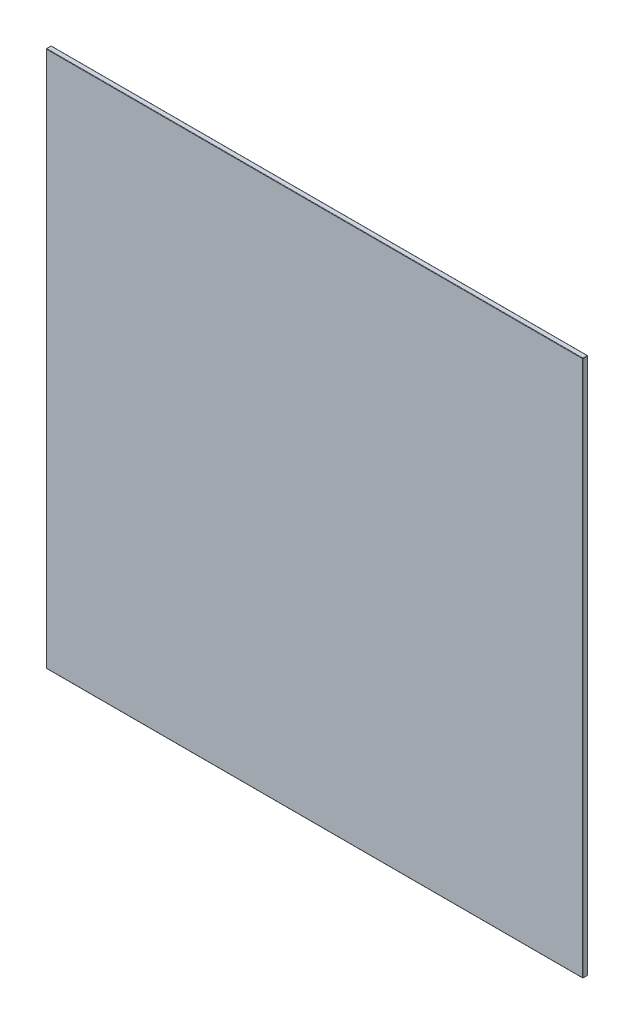
ISO-10303-21;
HEADER;
FILE_DESCRIPTION(('STEP AP214'),'2;1');
FILE_NAME('part.step','',(''),(''),'','','');
FILE_SCHEMA(('AUTOMOTIVE_DESIGN { 1 0 10303 214 1 1 1 1 }'));
ENDSEC;
DATA;
#1=APPLICATION_CONTEXT('core data for automotive mechanical design processes');
#2=APPLICATION_PROTOCOL_DEFINITION('international standard','automotive_design',2000,#1);
#3=PRODUCT_CONTEXT('',#1,'mechanical');
#4=PRODUCT('Part','Part','',(#3));
#5=PRODUCT_RELATED_PRODUCT_CATEGORY('part','',(#4));
#6=PRODUCT_DEFINITION_FORMATION('','',#4);
#7=PRODUCT_DEFINITION_CONTEXT('part definition',#1,'design');
#8=PRODUCT_DEFINITION('design','',#6,#7);
#9=PRODUCT_DEFINITION_SHAPE('','',#8);
#10=(LENGTH_UNIT() NAMED_UNIT(*) SI_UNIT(.MILLI.,.METRE.));
#11=(NAMED_UNIT(*) PLANE_ANGLE_UNIT() SI_UNIT($,.RADIAN.));
#12=(NAMED_UNIT(*) SI_UNIT($,.STERADIAN.) SOLID_ANGLE_UNIT());
#13=UNCERTAINTY_MEASURE_WITH_UNIT(LENGTH_MEASURE(1.E-05),#10,'distance_accuracy_value','');
#14=(GEOMETRIC_REPRESENTATION_CONTEXT(3) GLOBAL_UNCERTAINTY_ASSIGNED_CONTEXT((#13)) GLOBAL_UNIT_ASSIGNED_CONTEXT((#10,
#11,#12)) REPRESENTATION_CONTEXT('',''));
#15=CARTESIAN_POINT('',(0.,0.,0.));
#16=DIRECTION('',(0.,0.,1.));
#17=DIRECTION('',(1.,0.,0.));
#18=AXIS2_PLACEMENT_3D('',#15,#16,#17);
#19=CARTESIAN_POINT('',(160.,-160.,3.));
#20=DIRECTION('',(-1.,0.,0.));
#21=DIRECTION('',(0.,0.,1.));
#22=AXIS2_PLACEMENT_3D('',#19,#20,#21);
#23=PLANE('',#22);
#24=DIRECTION('',(0.,0.,-1.));
#25=VECTOR('',#24,1.);
#26=CARTESIAN_POINT('',(160.,159.75,3.));
#27=LINE('',#26,#25);
#28=CARTESIAN_POINT('',(160.,159.75,0.25));
#29=VERTEX_POINT('',#28);
#30=CARTESIAN_POINT('',(160.,159.75,2.75));
#31=VERTEX_POINT('',#30);
#32=EDGE_CURVE('E215',#29,#31,#27,.F.);
#33=ORIENTED_EDGE('',*,*,#32,.T.);
#34=DIRECTION('',(0.,1.,0.));
#35=VECTOR('',#34,1.);
#36=CARTESIAN_POINT('',(160.,-160.,2.75));
#37=LINE('',#36,#35);
#38=CARTESIAN_POINT('',(160.,-159.75,2.75));
#39=VERTEX_POINT('',#38);
#40=EDGE_CURVE('E218',#31,#39,#37,.F.);
#41=ORIENTED_EDGE('',*,*,#40,.T.);
#42=DIRECTION('',(0.,0.,-1.));
#43=VECTOR('',#42,1.);
#44=CARTESIAN_POINT('',(160.,-159.75,3.));
#45=LINE('',#44,#43);
#46=CARTESIAN_POINT('',(160.,-159.75,0.25));
#47=VERTEX_POINT('',#46);
#48=EDGE_CURVE('E216',#39,#47,#45,.T.);
#49=ORIENTED_EDGE('',*,*,#48,.T.);
#50=DIRECTION('',(0.,1.,0.));
#51=VECTOR('',#50,1.);
#52=CARTESIAN_POINT('',(160.,160.,0.25));
#53=LINE('',#52,#51);
#54=EDGE_CURVE('E212',#47,#29,#53,.T.);
#55=ORIENTED_EDGE('',*,*,#54,.T.);
#56=EDGE_LOOP('',(#33,#41,#49,#55));
#57=FACE_BOUND('',#56,.T.);
#58=ADVANCED_FACE('F33',(#57),#23,.F.);
#59=CARTESIAN_POINT('',(-160.,160.,3.));
#60=DIRECTION('',(0.,-1.,0.));
#61=DIRECTION('',(0.,0.,-1.));
#62=AXIS2_PLACEMENT_3D('',#59,#60,#61);
#63=PLANE('',#62);
#64=DIRECTION('',(-1.,0.,0.));
#65=VECTOR('',#64,1.);
#66=CARTESIAN_POINT('',(-160.,160.,2.75));
#67=LINE('',#66,#65);
#68=CARTESIAN_POINT('',(-159.75,160.,2.75));
#69=VERTEX_POINT('',#68);
#70=CARTESIAN_POINT('',(159.75,160.,2.75));
#71=VERTEX_POINT('',#70);
#72=EDGE_CURVE('E265',#69,#71,#67,.F.);
#73=ORIENTED_EDGE('',*,*,#72,.T.);
#74=DIRECTION('',(0.,0.,-1.));
#75=VECTOR('',#74,1.);
#76=CARTESIAN_POINT('',(159.75,160.,3.));
#77=LINE('',#76,#75);
#78=CARTESIAN_POINT('',(159.75,160.,0.25));
#79=VERTEX_POINT('',#78);
#80=EDGE_CURVE('E259',#71,#79,#77,.T.);
#81=ORIENTED_EDGE('',*,*,#80,.T.);
#82=DIRECTION('',(-1.,0.,0.));
#83=VECTOR('',#82,1.);
#84=CARTESIAN_POINT('',(-160.,160.,0.25));
#85=LINE('',#84,#83);
#86=CARTESIAN_POINT('',(-159.75,160.,0.25));
#87=VERTEX_POINT('',#86);
#88=EDGE_CURVE('E274',#79,#87,#85,.T.);
#89=ORIENTED_EDGE('',*,*,#88,.T.);
#90=DIRECTION('',(0.,0.,-1.));
#91=VECTOR('',#90,1.);
#92=CARTESIAN_POINT('',(-159.75,160.,3.));
#93=LINE('',#92,#91);
#94=EDGE_CURVE('E270',#87,#69,#93,.F.);
#95=ORIENTED_EDGE('',*,*,#94,.T.);
#96=EDGE_LOOP('',(#73,#81,#89,#95));
#97=FACE_BOUND('',#96,.T.);
#98=ADVANCED_FACE('F268',(#97),#63,.F.);
#99=CARTESIAN_POINT('',(-160.,-160.,3.));
#100=DIRECTION('',(1.,0.,0.));
#101=DIRECTION('',(0.,0.,-1.));
#102=AXIS2_PLACEMENT_3D('',#99,#100,#101);
#103=PLANE('',#102);
#104=DIRECTION('',(0.,-1.,0.));
#105=VECTOR('',#104,1.);
#106=CARTESIAN_POINT('',(-160.,-160.,2.75));
#107=LINE('',#106,#105);
#108=CARTESIAN_POINT('',(-160.,-159.75,2.75));
#109=VERTEX_POINT('',#108);
#110=CARTESIAN_POINT('',(-160.,159.75,2.75));
#111=VERTEX_POINT('',#110);
#112=EDGE_CURVE('E152',#109,#111,#107,.F.);
#113=ORIENTED_EDGE('',*,*,#112,.T.);
#114=DIRECTION('',(0.,0.,-1.));
#115=VECTOR('',#114,1.);
#116=CARTESIAN_POINT('',(-160.,159.75,3.));
#117=LINE('',#116,#115);
#118=CARTESIAN_POINT('',(-160.,159.75,0.25));
#119=VERTEX_POINT('',#118);
#120=EDGE_CURVE('E231',#111,#119,#117,.T.);
#121=ORIENTED_EDGE('',*,*,#120,.T.);
#122=DIRECTION('',(0.,-1.,0.));
#123=VECTOR('',#122,1.);
#124=CARTESIAN_POINT('',(-160.,-160.,0.25));
#125=LINE('',#124,#123);
#126=CARTESIAN_POINT('',(-160.,-159.75,0.25));
#127=VERTEX_POINT('',#126);
#128=EDGE_CURVE('E228',#119,#127,#125,.T.);
#129=ORIENTED_EDGE('',*,*,#128,.T.);
#130=DIRECTION('',(0.,0.,-1.));
#131=VECTOR('',#130,1.);
#132=CARTESIAN_POINT('',(-160.,-159.75,3.));
#133=LINE('',#132,#131);
#134=EDGE_CURVE('E226',#127,#109,#133,.F.);
#135=ORIENTED_EDGE('',*,*,#134,.T.);
#136=EDGE_LOOP('',(#113,#121,#129,#135));
#137=FACE_BOUND('',#136,.T.);
#138=ADVANCED_FACE('F327',(#137),#103,.F.);
#139=CARTESIAN_POINT('',(-160.,-160.,3.));
#140=DIRECTION('',(0.,1.,0.));
#141=DIRECTION('',(0.,0.,1.));
#142=AXIS2_PLACEMENT_3D('',#139,#140,#141);
#143=PLANE('',#142);
#144=DIRECTION('',(1.,0.,0.));
#145=VECTOR('',#144,1.);
#146=CARTESIAN_POINT('',(-160.,-160.,2.75));
#147=LINE('',#146,#145);
#148=CARTESIAN_POINT('',(159.75,-160.,2.75));
#149=VERTEX_POINT('',#148);
#150=CARTESIAN_POINT('',(-159.75,-160.,2.75));
#151=VERTEX_POINT('',#150);
#152=EDGE_CURVE('E42',#149,#151,#147,.F.);
#153=ORIENTED_EDGE('',*,*,#152,.T.);
#154=DIRECTION('',(0.,0.,-1.));
#155=VECTOR('',#154,1.);
#156=CARTESIAN_POINT('',(-159.75,-160.,3.));
#157=LINE('',#156,#155);
#158=CARTESIAN_POINT('',(-159.75,-160.,0.25));
#159=VERTEX_POINT('',#158);
#160=EDGE_CURVE('E11',#151,#159,#157,.T.);
#161=ORIENTED_EDGE('',*,*,#160,.T.);
#162=DIRECTION('',(1.,0.,0.));
#163=VECTOR('',#162,1.);
#164=CARTESIAN_POINT('',(160.,-160.,0.25));
#165=LINE('',#164,#163);
#166=CARTESIAN_POINT('',(159.75,-160.,0.25));
#167=VERTEX_POINT('',#166);
#168=EDGE_CURVE('E234',#159,#167,#165,.T.);
#169=ORIENTED_EDGE('',*,*,#168,.T.);
#170=DIRECTION('',(0.,0.,-1.));
#171=VECTOR('',#170,1.);
#172=CARTESIAN_POINT('',(159.75,-160.,3.));
#173=LINE('',#172,#171);
#174=EDGE_CURVE('E53',#167,#149,#173,.F.);
#175=ORIENTED_EDGE('',*,*,#174,.T.);
#176=EDGE_LOOP('',(#153,#161,#169,#175));
#177=FACE_BOUND('',#176,.T.);
#178=ADVANCED_FACE('F489',(#177),#143,.F.);
#179=CARTESIAN_POINT('',(0.,0.,3.));
#180=DIRECTION('',(0.,0.,-1.));
#181=DIRECTION('',(-1.,0.,0.));
#182=AXIS2_PLACEMENT_3D('',#179,#180,#181);
#183=PLANE('',#182);
#184=DIRECTION('',(0.,1.,0.));
#185=VECTOR('',#184,1.);
#186=CARTESIAN_POINT('',(159.75,0.,3.));
#187=LINE('',#186,#185);
#188=CARTESIAN_POINT('',(159.75,-159.75,3.));
#189=VERTEX_POINT('',#188);
#190=CARTESIAN_POINT('',(159.75,159.75,3.));
#191=VERTEX_POINT('',#190);
#192=EDGE_CURVE('E131',#189,#191,#187,.T.);
#193=ORIENTED_EDGE('',*,*,#192,.T.);
#194=DIRECTION('',(-1.,0.,0.));
#195=VECTOR('',#194,1.);
#196=CARTESIAN_POINT('',(0.,159.75,3.));
#197=LINE('',#196,#195);
#198=CARTESIAN_POINT('',(-159.75,159.75,3.));
#199=VERTEX_POINT('',#198);
#200=EDGE_CURVE('E127',#191,#199,#197,.T.);
#201=ORIENTED_EDGE('',*,*,#200,.T.);
#202=DIRECTION('',(0.,-1.,0.));
#203=VECTOR('',#202,1.);
#204=CARTESIAN_POINT('',(-159.75,0.,3.));
#205=LINE('',#204,#203);
#206=CARTESIAN_POINT('',(-159.75,-159.75,3.));
#207=VERTEX_POINT('',#206);
#208=EDGE_CURVE('E121',#199,#207,#205,.T.);
#209=ORIENTED_EDGE('',*,*,#208,.T.);
#210=DIRECTION('',(1.,0.,0.));
#211=VECTOR('',#210,1.);
#212=CARTESIAN_POINT('',(0.,-159.75,3.));
#213=LINE('',#212,#211);
#214=EDGE_CURVE('E124',#207,#189,#213,.T.);
#215=ORIENTED_EDGE('',*,*,#214,.T.);
#216=EDGE_LOOP('',(#193,#201,#209,#215));
#217=FACE_BOUND('',#216,.T.);
#218=ADVANCED_FACE('F123',(#217),#183,.F.);
#219=CARTESIAN_POINT('',(0.,0.,0.));
#220=DIRECTION('',(0.,0.,-1.));
#221=DIRECTION('',(-1.,0.,0.));
#222=AXIS2_PLACEMENT_3D('',#219,#220,#221);
#223=PLANE('',#222);
#224=DIRECTION('',(0.,-1.,0.));
#225=VECTOR('',#224,1.);
#226=CARTESIAN_POINT('',(-159.75,160.,0.));
#227=LINE('',#226,#225);
#228=CARTESIAN_POINT('',(-159.75,-159.75,0.));
#229=VERTEX_POINT('',#228);
#230=CARTESIAN_POINT('',(-159.75,159.75,0.));
#231=VERTEX_POINT('',#230);
#232=EDGE_CURVE('E280',#229,#231,#227,.F.);
#233=ORIENTED_EDGE('',*,*,#232,.T.);
#234=DIRECTION('',(-1.,0.,0.));
#235=VECTOR('',#234,1.);
#236=CARTESIAN_POINT('',(160.,159.75,0.));
#237=LINE('',#236,#235);
#238=CARTESIAN_POINT('',(159.75,159.75,0.));
#239=VERTEX_POINT('',#238);
#240=EDGE_CURVE('E220',#231,#239,#237,.F.);
#241=ORIENTED_EDGE('',*,*,#240,.T.);
#242=DIRECTION('',(0.,1.,0.));
#243=VECTOR('',#242,1.);
#244=CARTESIAN_POINT('',(159.75,-160.,0.));
#245=LINE('',#244,#243);
#246=CARTESIAN_POINT('',(159.75,-159.75,0.));
#247=VERTEX_POINT('',#246);
#248=EDGE_CURVE('E210',#239,#247,#245,.F.);
#249=ORIENTED_EDGE('',*,*,#248,.T.);
#250=DIRECTION('',(1.,0.,0.));
#251=VECTOR('',#250,1.);
#252=CARTESIAN_POINT('',(-160.,-159.75,0.));
#253=LINE('',#252,#251);
#254=EDGE_CURVE('E264',#247,#229,#253,.F.);
#255=ORIENTED_EDGE('',*,*,#254,.T.);
#256=EDGE_LOOP('',(#233,#241,#249,#255));
#257=FACE_BOUND('',#256,.T.);
#258=ADVANCED_FACE('F284',(#257),#223,.T.);
#259=CARTESIAN_POINT('',(-160.,-159.75,0.25));
#260=DIRECTION('',(-1.,0.,0.));
#261=DIRECTION('',(0.,0.,1.));
#262=AXIS2_PLACEMENT_3D('',#259,#260,#261);
#263=CYLINDRICAL_SURFACE('',#262,0.25);
#264=CARTESIAN_POINT('',(159.75,-159.75,0.25));
#265=DIRECTION('',(1.,0.,0.));
#266=DIRECTION('',(0.,0.,-1.));
#267=AXIS2_PLACEMENT_3D('',#264,#265,#266);
#268=CIRCLE('',#267,0.25);
#269=EDGE_CURVE('E37',#167,#247,#268,.T.);
#270=ORIENTED_EDGE('',*,*,#269,.F.);
#271=ORIENTED_EDGE('',*,*,#168,.F.);
#272=CARTESIAN_POINT('',(-159.75,-159.75,0.25));
#273=DIRECTION('',(-1.,0.,0.));
#274=DIRECTION('',(0.,0.,1.));
#275=AXIS2_PLACEMENT_3D('',#272,#273,#274);
#276=CIRCLE('',#275,0.25);
#277=EDGE_CURVE('E190',#229,#159,#276,.T.);
#278=ORIENTED_EDGE('',*,*,#277,.F.);
#279=ORIENTED_EDGE('',*,*,#254,.F.);
#280=EDGE_LOOP('',(#270,#271,#278,#279));
#281=FACE_BOUND('',#280,.T.);
#282=ADVANCED_FACE('F35',(#281),#263,.T.);
#283=CARTESIAN_POINT('',(159.75,-159.75,0.25));
#284=DIRECTION('',(0.,0.,1.));
#285=DIRECTION('',(1.,0.,0.));
#286=AXIS2_PLACEMENT_3D('',#283,#284,#285);
#287=SPHERICAL_SURFACE('',#286,0.25);
#288=CARTESIAN_POINT('',(159.75,-159.75,0.25));
#289=DIRECTION('',(0.,0.,-1.));
#290=DIRECTION('',(-1.,0.,0.));
#291=AXIS2_PLACEMENT_3D('',#288,#289,#290);
#292=CIRCLE('',#291,0.25);
#293=EDGE_CURVE('E185',#167,#47,#292,.F.);
#294=ORIENTED_EDGE('',*,*,#293,.F.);
#295=ORIENTED_EDGE('',*,*,#269,.T.);
#296=CARTESIAN_POINT('',(159.75,-159.75,0.25));
#297=DIRECTION('',(0.,-1.,0.));
#298=DIRECTION('',(0.,0.,-1.));
#299=AXIS2_PLACEMENT_3D('',#296,#297,#298);
#300=CIRCLE('',#299,0.25);
#301=EDGE_CURVE('E188',#47,#247,#300,.F.);
#302=ORIENTED_EDGE('',*,*,#301,.F.);
#303=EDGE_LOOP('',(#294,#295,#302));
#304=FACE_BOUND('',#303,.T.);
#305=ADVANCED_FACE('F202',(#304),#287,.T.);
#306=CARTESIAN_POINT('',(-159.75,-159.75,0.25));
#307=DIRECTION('',(0.,0.,1.));
#308=DIRECTION('',(1.,0.,0.));
#309=AXIS2_PLACEMENT_3D('',#306,#307,#308);
#310=SPHERICAL_SURFACE('',#309,0.25);
#311=CARTESIAN_POINT('',(-159.75,-159.75,0.25));
#312=DIRECTION('',(0.,-1.,0.));
#313=DIRECTION('',(0.,0.,-1.));
#314=AXIS2_PLACEMENT_3D('',#311,#312,#313);
#315=CIRCLE('',#314,0.25);
#316=EDGE_CURVE('E180',#229,#127,#315,.F.);
#317=ORIENTED_EDGE('',*,*,#316,.F.);
#318=ORIENTED_EDGE('',*,*,#277,.T.);
#319=CARTESIAN_POINT('',(-159.75,-159.75,0.25));
#320=DIRECTION('',(0.,0.,-1.));
#321=DIRECTION('',(-1.,0.,0.));
#322=AXIS2_PLACEMENT_3D('',#319,#320,#321);
#323=CIRCLE('',#322,0.25);
#324=EDGE_CURVE('E183',#127,#159,#323,.F.);
#325=ORIENTED_EDGE('',*,*,#324,.F.);
#326=EDGE_LOOP('',(#317,#318,#325));
#327=FACE_BOUND('',#326,.T.);
#328=ADVANCED_FACE('F455',(#327),#310,.T.);
#329=CARTESIAN_POINT('',(159.75,-160.,0.25));
#330=DIRECTION('',(0.,-1.,0.));
#331=DIRECTION('',(0.,0.,-1.));
#332=AXIS2_PLACEMENT_3D('',#329,#330,#331);
#333=CYLINDRICAL_SURFACE('',#332,0.25);
#334=ORIENTED_EDGE('',*,*,#301,.T.);
#335=ORIENTED_EDGE('',*,*,#248,.F.);
#336=CARTESIAN_POINT('',(159.75,159.75,0.25));
#337=DIRECTION('',(0.,1.,0.));
#338=DIRECTION('',(0.,0.,1.));
#339=AXIS2_PLACEMENT_3D('',#336,#337,#338);
#340=CIRCLE('',#339,0.25);
#341=EDGE_CURVE('E175',#29,#239,#340,.T.);
#342=ORIENTED_EDGE('',*,*,#341,.F.);
#343=ORIENTED_EDGE('',*,*,#54,.F.);
#344=EDGE_LOOP('',(#334,#335,#342,#343));
#345=FACE_BOUND('',#344,.T.);
#346=ADVANCED_FACE('F208',(#345),#333,.T.);
#347=CARTESIAN_POINT('',(159.75,-159.75,3.));
#348=DIRECTION('',(0.,0.,-1.));
#349=DIRECTION('',(-1.,0.,0.));
#350=AXIS2_PLACEMENT_3D('',#347,#348,#349);
#351=CYLINDRICAL_SURFACE('',#350,0.25);
#352=ORIENTED_EDGE('',*,*,#293,.T.);
#353=ORIENTED_EDGE('',*,*,#48,.F.);
#354=CARTESIAN_POINT('',(159.75,-159.75,2.75));
#355=DIRECTION('',(0.,0.,1.));
#356=DIRECTION('',(1.,0.,0.));
#357=AXIS2_PLACEMENT_3D('',#354,#355,#356);
#358=CIRCLE('',#357,0.25);
#359=EDGE_CURVE('E172',#149,#39,#358,.T.);
#360=ORIENTED_EDGE('',*,*,#359,.F.);
#361=ORIENTED_EDGE('',*,*,#174,.F.);
#362=EDGE_LOOP('',(#352,#353,#360,#361));
#363=FACE_BOUND('',#362,.T.);
#364=ADVANCED_FACE('F309',(#363),#351,.T.);
#365=CARTESIAN_POINT('',(0.,-159.75,2.75));
#366=DIRECTION('',(1.,0.,0.));
#367=DIRECTION('',(0.,0.,-1.));
#368=AXIS2_PLACEMENT_3D('',#365,#366,#367);
#369=CYLINDRICAL_SURFACE('',#368,0.25);
#370=CARTESIAN_POINT('',(-159.75,-159.75,2.75));
#371=DIRECTION('',(-1.,0.,0.));
#372=DIRECTION('',(0.,0.,1.));
#373=AXIS2_PLACEMENT_3D('',#370,#371,#372);
#374=CIRCLE('',#373,0.25);
#375=EDGE_CURVE('E137',#151,#207,#374,.T.);
#376=ORIENTED_EDGE('',*,*,#375,.F.);
#377=ORIENTED_EDGE('',*,*,#152,.F.);
#378=CARTESIAN_POINT('',(159.75,-159.75,2.75));
#379=DIRECTION('',(1.,0.,0.));
#380=DIRECTION('',(0.,0.,-1.));
#381=AXIS2_PLACEMENT_3D('',#378,#379,#380);
#382=CIRCLE('',#381,0.25);
#383=EDGE_CURVE('E140',#189,#149,#382,.T.);
#384=ORIENTED_EDGE('',*,*,#383,.F.);
#385=ORIENTED_EDGE('',*,*,#214,.F.);
#386=EDGE_LOOP('',(#376,#377,#384,#385));
#387=FACE_BOUND('',#386,.T.);
#388=ADVANCED_FACE('F136',(#387),#369,.T.);
#389=CARTESIAN_POINT('',(-159.75,-159.75,3.));
#390=DIRECTION('',(0.,0.,-1.));
#391=DIRECTION('',(-1.,0.,0.));
#392=AXIS2_PLACEMENT_3D('',#389,#390,#391);
#393=CYLINDRICAL_SURFACE('',#392,0.25);
#394=ORIENTED_EDGE('',*,*,#324,.T.);
#395=ORIENTED_EDGE('',*,*,#160,.F.);
#396=CARTESIAN_POINT('',(-159.75,-159.75,2.75));
#397=DIRECTION('',(0.,0.,1.));
#398=DIRECTION('',(1.,0.,0.));
#399=AXIS2_PLACEMENT_3D('',#396,#397,#398);
#400=CIRCLE('',#399,0.25);
#401=EDGE_CURVE('E149',#109,#151,#400,.T.);
#402=ORIENTED_EDGE('',*,*,#401,.F.);
#403=ORIENTED_EDGE('',*,*,#134,.F.);
#404=EDGE_LOOP('',(#394,#395,#402,#403));
#405=FACE_BOUND('',#404,.T.);
#406=ADVANCED_FACE('F425',(#405),#393,.T.);
#407=CARTESIAN_POINT('',(-159.75,-160.,0.25));
#408=DIRECTION('',(0.,1.,0.));
#409=DIRECTION('',(0.,0.,1.));
#410=AXIS2_PLACEMENT_3D('',#407,#408,#409);
#411=CYLINDRICAL_SURFACE('',#410,0.25);
#412=ORIENTED_EDGE('',*,*,#316,.T.);
#413=ORIENTED_EDGE('',*,*,#128,.F.);
#414=CARTESIAN_POINT('',(-159.75,159.75,0.25));
#415=DIRECTION('',(1.11022302462516E-13,1.,0.));
#416=DIRECTION('',(-1.,1.11022302462516E-13,0.));
#417=AXIS2_PLACEMENT_3D('',#414,#415,#416);
#418=CIRCLE('',#417,0.25);
#419=EDGE_CURVE('E167',#231,#119,#418,.T.);
#420=ORIENTED_EDGE('',*,*,#419,.F.);
#421=ORIENTED_EDGE('',*,*,#232,.F.);
#422=EDGE_LOOP('',(#412,#413,#420,#421));
#423=FACE_BOUND('',#422,.T.);
#424=ADVANCED_FACE('F294',(#423),#411,.T.);
#425=CARTESIAN_POINT('',(-160.,159.75,0.25));
#426=DIRECTION('',(1.,0.,0.));
#427=DIRECTION('',(0.,0.,-1.));
#428=AXIS2_PLACEMENT_3D('',#425,#426,#427);
#429=CYLINDRICAL_SURFACE('',#428,0.25);
#430=CARTESIAN_POINT('',(159.75,159.75,0.25));
#431=DIRECTION('',(1.,1.11022302462516E-13,0.));
#432=DIRECTION('',(-1.11022302462516E-13,1.,0.));
#433=AXIS2_PLACEMENT_3D('',#430,#431,#432);
#434=CIRCLE('',#433,0.25);
#435=EDGE_CURVE('E177',#239,#79,#434,.T.);
#436=ORIENTED_EDGE('',*,*,#435,.F.);
#437=ORIENTED_EDGE('',*,*,#240,.F.);
#438=CARTESIAN_POINT('',(-159.75,159.75,0.25));
#439=DIRECTION('',(-1.,0.,0.));
#440=DIRECTION('',(0.,0.,1.));
#441=AXIS2_PLACEMENT_3D('',#438,#439,#440);
#442=CIRCLE('',#441,0.25);
#443=EDGE_CURVE('E164',#87,#231,#442,.T.);
#444=ORIENTED_EDGE('',*,*,#443,.F.);
#445=ORIENTED_EDGE('',*,*,#88,.F.);
#446=EDGE_LOOP('',(#436,#437,#444,#445));
#447=FACE_BOUND('',#446,.T.);
#448=ADVANCED_FACE('F290',(#447),#429,.T.);
#449=CARTESIAN_POINT('',(159.75,159.75,0.25));
#450=DIRECTION('',(0.,0.,1.));
#451=DIRECTION('',(1.,0.,0.));
#452=AXIS2_PLACEMENT_3D('',#449,#450,#451);
#453=SPHERICAL_SURFACE('',#452,0.25);
#454=ORIENTED_EDGE('',*,*,#341,.T.);
#455=ORIENTED_EDGE('',*,*,#435,.T.);
#456=CARTESIAN_POINT('',(159.75,159.75,0.25));
#457=DIRECTION('',(0.,0.,-1.));
#458=DIRECTION('',(-1.,0.,0.));
#459=AXIS2_PLACEMENT_3D('',#456,#457,#458);
#460=CIRCLE('',#459,0.25);
#461=EDGE_CURVE('E156',#29,#79,#460,.F.);
#462=ORIENTED_EDGE('',*,*,#461,.F.);
#463=EDGE_LOOP('',(#454,#455,#462));
#464=FACE_BOUND('',#463,.T.);
#465=ADVANCED_FACE('F313',(#464),#453,.T.);
#466=CARTESIAN_POINT('',(159.75,-159.75,2.75));
#467=DIRECTION('',(0.,0.,1.));
#468=DIRECTION('',(1.,0.,0.));
#469=AXIS2_PLACEMENT_3D('',#466,#467,#468);
#470=SPHERICAL_SURFACE('',#469,0.25);
#471=ORIENTED_EDGE('',*,*,#383,.T.);
#472=ORIENTED_EDGE('',*,*,#359,.T.);
#473=CARTESIAN_POINT('',(159.75,-159.75,2.75));
#474=DIRECTION('',(0.,-1.,0.));
#475=DIRECTION('',(0.,0.,-1.));
#476=AXIS2_PLACEMENT_3D('',#473,#474,#475);
#477=CIRCLE('',#476,0.25);
#478=EDGE_CURVE('E153',#189,#39,#477,.F.);
#479=ORIENTED_EDGE('',*,*,#478,.F.);
#480=EDGE_LOOP('',(#471,#472,#479));
#481=FACE_BOUND('',#480,.T.);
#482=ADVANCED_FACE('F311',(#481),#470,.T.);
#483=CARTESIAN_POINT('',(-159.75,-159.75,2.75));
#484=DIRECTION('',(0.,0.,1.));
#485=DIRECTION('',(1.,0.,0.));
#486=AXIS2_PLACEMENT_3D('',#483,#484,#485);
#487=SPHERICAL_SURFACE('',#486,0.25);
#488=ORIENTED_EDGE('',*,*,#401,.T.);
#489=ORIENTED_EDGE('',*,*,#375,.T.);
#490=CARTESIAN_POINT('',(-159.75,-159.75,2.75));
#491=DIRECTION('',(0.,-1.,0.));
#492=DIRECTION('',(0.,0.,-1.));
#493=AXIS2_PLACEMENT_3D('',#490,#491,#492);
#494=CIRCLE('',#493,0.25);
#495=EDGE_CURVE('E146',#109,#207,#494,.F.);
#496=ORIENTED_EDGE('',*,*,#495,.F.);
#497=EDGE_LOOP('',(#488,#489,#496));
#498=FACE_BOUND('',#497,.T.);
#499=ADVANCED_FACE('F145',(#498),#487,.T.);
#500=CARTESIAN_POINT('',(-159.75,159.75,0.25));
#501=DIRECTION('',(0.,0.,1.));
#502=DIRECTION('',(1.,0.,0.));
#503=AXIS2_PLACEMENT_3D('',#500,#501,#502);
#504=SPHERICAL_SURFACE('',#503,0.25);
#505=ORIENTED_EDGE('',*,*,#443,.T.);
#506=ORIENTED_EDGE('',*,*,#419,.T.);
#507=CARTESIAN_POINT('',(-159.75,159.75,0.25));
#508=DIRECTION('',(0.,0.,-1.));
#509=DIRECTION('',(-1.,0.,0.));
#510=AXIS2_PLACEMENT_3D('',#507,#508,#509);
#511=CIRCLE('',#510,0.25);
#512=EDGE_CURVE('E154',#87,#119,#511,.F.);
#513=ORIENTED_EDGE('',*,*,#512,.F.);
#514=EDGE_LOOP('',(#505,#506,#513));
#515=FACE_BOUND('',#514,.T.);
#516=ADVANCED_FACE('F296',(#515),#504,.T.);
#517=CARTESIAN_POINT('',(159.75,159.75,3.));
#518=DIRECTION('',(0.,0.,-1.));
#519=DIRECTION('',(-1.,0.,0.));
#520=AXIS2_PLACEMENT_3D('',#517,#518,#519);
#521=CYLINDRICAL_SURFACE('',#520,0.25);
#522=ORIENTED_EDGE('',*,*,#461,.T.);
#523=ORIENTED_EDGE('',*,*,#80,.F.);
#524=CARTESIAN_POINT('',(159.75,159.75,2.75));
#525=DIRECTION('',(0.,0.,1.));
#526=DIRECTION('',(1.,0.,0.));
#527=AXIS2_PLACEMENT_3D('',#524,#525,#526);
#528=CIRCLE('',#527,0.25);
#529=EDGE_CURVE('E158',#31,#71,#528,.T.);
#530=ORIENTED_EDGE('',*,*,#529,.F.);
#531=ORIENTED_EDGE('',*,*,#32,.F.);
#532=EDGE_LOOP('',(#522,#523,#530,#531));
#533=FACE_BOUND('',#532,.T.);
#534=ADVANCED_FACE('F261',(#533),#521,.T.);
#535=CARTESIAN_POINT('',(159.75,0.,2.75));
#536=DIRECTION('',(0.,1.,0.));
#537=DIRECTION('',(0.,0.,1.));
#538=AXIS2_PLACEMENT_3D('',#535,#536,#537);
#539=CYLINDRICAL_SURFACE('',#538,0.25);
#540=ORIENTED_EDGE('',*,*,#478,.T.);
#541=ORIENTED_EDGE('',*,*,#40,.F.);
#542=CARTESIAN_POINT('',(159.75,159.75,2.75));
#543=DIRECTION('',(0.,1.,0.));
#544=DIRECTION('',(0.,0.,1.));
#545=AXIS2_PLACEMENT_3D('',#542,#543,#544);
#546=CIRCLE('',#545,0.25);
#547=EDGE_CURVE('E248',#191,#31,#546,.T.);
#548=ORIENTED_EDGE('',*,*,#547,.F.);
#549=ORIENTED_EDGE('',*,*,#192,.F.);
#550=EDGE_LOOP('',(#540,#541,#548,#549));
#551=FACE_BOUND('',#550,.T.);
#552=ADVANCED_FACE('F305',(#551),#539,.T.);
#553=CARTESIAN_POINT('',(-159.75,0.,2.75));
#554=DIRECTION('',(0.,-1.,0.));
#555=DIRECTION('',(0.,0.,-1.));
#556=AXIS2_PLACEMENT_3D('',#553,#554,#555);
#557=CYLINDRICAL_SURFACE('',#556,0.25);
#558=ORIENTED_EDGE('',*,*,#495,.T.);
#559=ORIENTED_EDGE('',*,*,#208,.F.);
#560=CARTESIAN_POINT('',(-159.75,159.75,2.75));
#561=DIRECTION('',(0.,1.,1.11022302462516E-13));
#562=DIRECTION('',(0.,-1.11022302462516E-13,1.));
#563=AXIS2_PLACEMENT_3D('',#560,#561,#562);
#564=CIRCLE('',#563,0.25);
#565=EDGE_CURVE('E245',#111,#199,#564,.T.);
#566=ORIENTED_EDGE('',*,*,#565,.F.);
#567=ORIENTED_EDGE('',*,*,#112,.F.);
#568=EDGE_LOOP('',(#558,#559,#566,#567));
#569=FACE_BOUND('',#568,.T.);
#570=ADVANCED_FACE('F151',(#569),#557,.T.);
#571=CARTESIAN_POINT('',(-159.75,159.75,3.));
#572=DIRECTION('',(0.,0.,-1.));
#573=DIRECTION('',(-1.,0.,0.));
#574=AXIS2_PLACEMENT_3D('',#571,#572,#573);
#575=CYLINDRICAL_SURFACE('',#574,0.25);
#576=ORIENTED_EDGE('',*,*,#512,.T.);
#577=ORIENTED_EDGE('',*,*,#120,.F.);
#578=CARTESIAN_POINT('',(-159.75,159.75,2.75));
#579=DIRECTION('',(0.,0.,1.));
#580=DIRECTION('',(1.,0.,0.));
#581=AXIS2_PLACEMENT_3D('',#578,#579,#580);
#582=CIRCLE('',#581,0.25);
#583=EDGE_CURVE('E242',#69,#111,#582,.T.);
#584=ORIENTED_EDGE('',*,*,#583,.F.);
#585=ORIENTED_EDGE('',*,*,#94,.F.);
#586=EDGE_LOOP('',(#576,#577,#584,#585));
#587=FACE_BOUND('',#586,.T.);
#588=ADVANCED_FACE('F299',(#587),#575,.T.);
#589=CARTESIAN_POINT('',(159.75,159.75,2.75));
#590=DIRECTION('',(0.,0.,1.));
#591=DIRECTION('',(1.,0.,0.));
#592=AXIS2_PLACEMENT_3D('',#589,#590,#591);
#593=SPHERICAL_SURFACE('',#592,0.25);
#594=ORIENTED_EDGE('',*,*,#547,.T.);
#595=ORIENTED_EDGE('',*,*,#529,.T.);
#596=CARTESIAN_POINT('',(159.75,159.75,2.75));
#597=DIRECTION('',(1.,0.,-1.11022302462516E-13));
#598=DIRECTION('',(-1.11022302462516E-13,0.,-1.));
#599=AXIS2_PLACEMENT_3D('',#596,#597,#598);
#600=CIRCLE('',#599,0.25);
#601=EDGE_CURVE('E240',#191,#71,#600,.F.);
#602=ORIENTED_EDGE('',*,*,#601,.F.);
#603=EDGE_LOOP('',(#594,#595,#602));
#604=FACE_BOUND('',#603,.T.);
#605=ADVANCED_FACE('F255',(#604),#593,.T.);
#606=CARTESIAN_POINT('',(-159.75,159.75,2.75));
#607=DIRECTION('',(0.,0.,1.));
#608=DIRECTION('',(1.,0.,0.));
#609=AXIS2_PLACEMENT_3D('',#606,#607,#608);
#610=SPHERICAL_SURFACE('',#609,0.25);
#611=ORIENTED_EDGE('',*,*,#583,.T.);
#612=ORIENTED_EDGE('',*,*,#565,.T.);
#613=CARTESIAN_POINT('',(-159.75,159.75,2.75));
#614=DIRECTION('',(-1.,0.,0.));
#615=DIRECTION('',(0.,0.,1.));
#616=AXIS2_PLACEMENT_3D('',#613,#614,#615);
#617=CIRCLE('',#616,0.25);
#618=EDGE_CURVE('E238',#69,#199,#617,.F.);
#619=ORIENTED_EDGE('',*,*,#618,.F.);
#620=EDGE_LOOP('',(#611,#612,#619));
#621=FACE_BOUND('',#620,.T.);
#622=ADVANCED_FACE('F334',(#621),#610,.T.);
#623=CARTESIAN_POINT('',(0.,159.75,2.75));
#624=DIRECTION('',(-1.,0.,0.));
#625=DIRECTION('',(0.,0.,1.));
#626=AXIS2_PLACEMENT_3D('',#623,#624,#625);
#627=CYLINDRICAL_SURFACE('',#626,0.25);
#628=ORIENTED_EDGE('',*,*,#601,.T.);
#629=ORIENTED_EDGE('',*,*,#72,.F.);
#630=ORIENTED_EDGE('',*,*,#618,.T.);
#631=ORIENTED_EDGE('',*,*,#200,.F.);
#632=EDGE_LOOP('',(#628,#629,#630,#631));
#633=FACE_BOUND('',#632,.T.);
#634=ADVANCED_FACE('F331',(#633),#627,.T.);
#635=CLOSED_SHELL('',(#58,#98,#138,#178,#218,#258,#282,#305,#328,#346,#364,#388,#406,#424,#448,
#465,#482,#499,#516,#534,#552,#570,#588,#605,#622,#634));
#636=MANIFOLD_SOLID_BREP('B2',#635);
#637=ADVANCED_BREP_SHAPE_REPRESENTATION('',(#18,#636),#14);
#638=SHAPE_DEFINITION_REPRESENTATION(#9,#637);
ENDSEC;
END-ISO-10303-21;
